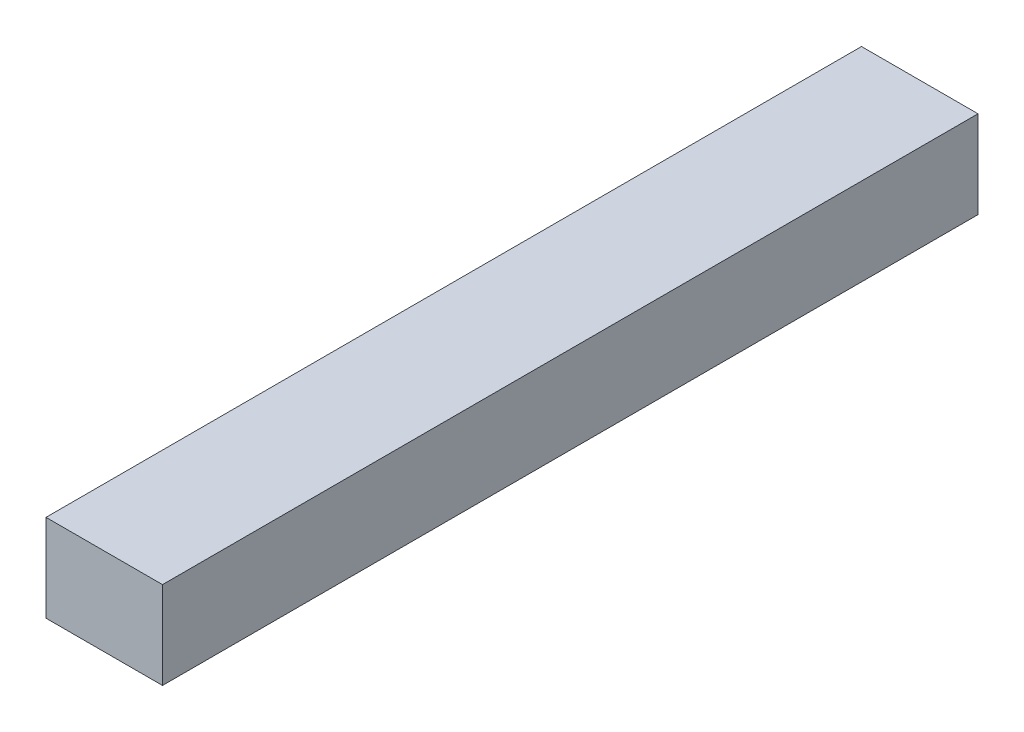
ISO-10303-21;
HEADER;
FILE_DESCRIPTION(('STEP AP214'),'2;1');
FILE_NAME('part.step','',(''),(''),'','','');
FILE_SCHEMA(('AUTOMOTIVE_DESIGN { 1 0 10303 214 1 1 1 1 }'));
ENDSEC;
DATA;
#1=APPLICATION_CONTEXT('core data for automotive mechanical design processes');
#2=APPLICATION_PROTOCOL_DEFINITION('international standard','automotive_design',2000,#1);
#3=PRODUCT_CONTEXT('',#1,'mechanical');
#4=PRODUCT('Part','Part','',(#3));
#5=PRODUCT_RELATED_PRODUCT_CATEGORY('part','',(#4));
#6=PRODUCT_DEFINITION_FORMATION('','',#4);
#7=PRODUCT_DEFINITION_CONTEXT('part definition',#1,'design');
#8=PRODUCT_DEFINITION('design','',#6,#7);
#9=PRODUCT_DEFINITION_SHAPE('','',#8);
#10=(LENGTH_UNIT() NAMED_UNIT(*) SI_UNIT(.MILLI.,.METRE.));
#11=(NAMED_UNIT(*) PLANE_ANGLE_UNIT() SI_UNIT($,.RADIAN.));
#12=(NAMED_UNIT(*) SI_UNIT($,.STERADIAN.) SOLID_ANGLE_UNIT());
#13=UNCERTAINTY_MEASURE_WITH_UNIT(LENGTH_MEASURE(1.E-05),#10,'distance_accuracy_value','');
#14=(GEOMETRIC_REPRESENTATION_CONTEXT(3) GLOBAL_UNCERTAINTY_ASSIGNED_CONTEXT((#13)) GLOBAL_UNIT_ASSIGNED_CONTEXT((#10,
#11,#12)) REPRESENTATION_CONTEXT('',''));
#15=CARTESIAN_POINT('',(0.,0.,0.));
#16=DIRECTION('',(0.,0.,1.));
#17=DIRECTION('',(1.,0.,0.));
#18=AXIS2_PLACEMENT_3D('',#15,#16,#17);
#19=CARTESIAN_POINT('',(25.4,0.,0.));
#20=DIRECTION('',(0.,0.,-1.));
#21=DIRECTION('',(-1.,0.,0.));
#22=AXIS2_PLACEMENT_3D('',#19,#20,#21);
#23=PLANE('',#22);
#24=DIRECTION('',(0.,-1.,0.));
#25=VECTOR('',#24,1.);
#26=CARTESIAN_POINT('',(0.,0.,0.));
#27=LINE('',#26,#25);
#28=CARTESIAN_POINT('',(0.,19.05,0.));
#29=VERTEX_POINT('',#28);
#30=CARTESIAN_POINT('',(0.,0.,0.));
#31=VERTEX_POINT('',#30);
#32=EDGE_CURVE('E96',#29,#31,#27,.T.);
#33=ORIENTED_EDGE('',*,*,#32,.T.);
#34=DIRECTION('',(-1.,0.,0.));
#35=VECTOR('',#34,1.);
#36=CARTESIAN_POINT('',(25.4,0.,0.));
#37=LINE('',#36,#35);
#38=CARTESIAN_POINT('',(25.4,0.,0.));
#39=VERTEX_POINT('',#38);
#40=EDGE_CURVE('E11',#39,#31,#37,.T.);
#41=ORIENTED_EDGE('',*,*,#40,.F.);
#42=DIRECTION('',(0.,-1.,0.));
#43=VECTOR('',#42,1.);
#44=CARTESIAN_POINT('',(25.4,0.,0.));
#45=LINE('',#44,#43);
#46=CARTESIAN_POINT('',(25.4,19.05,0.));
#47=VERTEX_POINT('',#46);
#48=EDGE_CURVE('E84',#47,#39,#45,.T.);
#49=ORIENTED_EDGE('',*,*,#48,.F.);
#50=DIRECTION('',(-1.,0.,0.));
#51=VECTOR('',#50,1.);
#52=CARTESIAN_POINT('',(25.4,19.05,0.));
#53=LINE('',#52,#51);
#54=EDGE_CURVE('E92',#47,#29,#53,.T.);
#55=ORIENTED_EDGE('',*,*,#54,.T.);
#56=EDGE_LOOP('',(#33,#41,#49,#55));
#57=FACE_BOUND('',#56,.T.);
#58=ADVANCED_FACE('F33',(#57),#23,.F.);
#59=CARTESIAN_POINT('',(25.4,0.,0.));
#60=DIRECTION('',(0.,1.,0.));
#61=DIRECTION('',(0.,0.,1.));
#62=AXIS2_PLACEMENT_3D('',#59,#60,#61);
#63=PLANE('',#62);
#64=DIRECTION('',(0.,0.,-1.));
#65=VECTOR('',#64,1.);
#66=CARTESIAN_POINT('',(0.,0.,0.));
#67=LINE('',#66,#65);
#68=CARTESIAN_POINT('',(0.,0.,-177.8));
#69=VERTEX_POINT('',#68);
#70=EDGE_CURVE('E88',#31,#69,#67,.T.);
#71=ORIENTED_EDGE('',*,*,#70,.T.);
#72=DIRECTION('',(-1.,0.,0.));
#73=VECTOR('',#72,1.);
#74=CARTESIAN_POINT('',(25.4,0.,-177.8));
#75=LINE('',#74,#73);
#76=CARTESIAN_POINT('',(25.4,0.,-177.8));
#77=VERTEX_POINT('',#76);
#78=EDGE_CURVE('E41',#77,#69,#75,.T.);
#79=ORIENTED_EDGE('',*,*,#78,.F.);
#80=DIRECTION('',(0.,0.,-1.));
#81=VECTOR('',#80,1.);
#82=CARTESIAN_POINT('',(25.4,0.,0.));
#83=LINE('',#82,#81);
#84=EDGE_CURVE('E79',#39,#77,#83,.T.);
#85=ORIENTED_EDGE('',*,*,#84,.F.);
#86=ORIENTED_EDGE('',*,*,#40,.T.);
#87=EDGE_LOOP('',(#71,#79,#85,#86));
#88=FACE_BOUND('',#87,.T.);
#89=ADVANCED_FACE('F87',(#88),#63,.F.);
#90=CARTESIAN_POINT('',(25.4,0.,-177.8));
#91=DIRECTION('',(0.,0.,1.));
#92=DIRECTION('',(1.,0.,0.));
#93=AXIS2_PLACEMENT_3D('',#90,#91,#92);
#94=PLANE('',#93);
#95=DIRECTION('',(0.,1.,0.));
#96=VECTOR('',#95,1.);
#97=CARTESIAN_POINT('',(0.,0.,-177.8));
#98=LINE('',#97,#96);
#99=CARTESIAN_POINT('',(0.,19.05,-177.8));
#100=VERTEX_POINT('',#99);
#101=EDGE_CURVE('E66',#69,#100,#98,.T.);
#102=ORIENTED_EDGE('',*,*,#101,.T.);
#103=DIRECTION('',(-1.,0.,0.));
#104=VECTOR('',#103,1.);
#105=CARTESIAN_POINT('',(25.4,19.05,-177.8));
#106=LINE('',#105,#104);
#107=CARTESIAN_POINT('',(25.4,19.05,-177.8));
#108=VERTEX_POINT('',#107);
#109=EDGE_CURVE('E89',#108,#100,#106,.T.);
#110=ORIENTED_EDGE('',*,*,#109,.F.);
#111=DIRECTION('',(0.,1.,0.));
#112=VECTOR('',#111,1.);
#113=CARTESIAN_POINT('',(25.4,0.,-177.8));
#114=LINE('',#113,#112);
#115=EDGE_CURVE('E82',#77,#108,#114,.T.);
#116=ORIENTED_EDGE('',*,*,#115,.F.);
#117=ORIENTED_EDGE('',*,*,#78,.T.);
#118=EDGE_LOOP('',(#102,#110,#116,#117));
#119=FACE_BOUND('',#118,.T.);
#120=ADVANCED_FACE('F90',(#119),#94,.F.);
#121=CARTESIAN_POINT('',(25.4,19.05,0.));
#122=DIRECTION('',(0.,-1.,0.));
#123=DIRECTION('',(0.,0.,-1.));
#124=AXIS2_PLACEMENT_3D('',#121,#122,#123);
#125=PLANE('',#124);
#126=DIRECTION('',(0.,0.,1.));
#127=VECTOR('',#126,1.);
#128=CARTESIAN_POINT('',(0.,19.05,0.));
#129=LINE('',#128,#127);
#130=EDGE_CURVE('E72',#100,#29,#129,.T.);
#131=ORIENTED_EDGE('',*,*,#130,.T.);
#132=ORIENTED_EDGE('',*,*,#54,.F.);
#133=DIRECTION('',(0.,0.,1.));
#134=VECTOR('',#133,1.);
#135=CARTESIAN_POINT('',(25.4,19.05,0.));
#136=LINE('',#135,#134);
#137=EDGE_CURVE('E49',#108,#47,#136,.T.);
#138=ORIENTED_EDGE('',*,*,#137,.F.);
#139=ORIENTED_EDGE('',*,*,#109,.T.);
#140=EDGE_LOOP('',(#131,#132,#138,#139));
#141=FACE_BOUND('',#140,.T.);
#142=ADVANCED_FACE('F103',(#141),#125,.F.);
#143=CARTESIAN_POINT('',(25.4,0.,0.));
#144=DIRECTION('',(-1.,0.,0.));
#145=DIRECTION('',(0.,0.,1.));
#146=AXIS2_PLACEMENT_3D('',#143,#144,#145);
#147=PLANE('',#146);
#148=ORIENTED_EDGE('',*,*,#48,.T.);
#149=ORIENTED_EDGE('',*,*,#84,.T.);
#150=ORIENTED_EDGE('',*,*,#115,.T.);
#151=ORIENTED_EDGE('',*,*,#137,.T.);
#152=EDGE_LOOP('',(#148,#149,#150,#151));
#153=FACE_BOUND('',#152,.T.);
#154=ADVANCED_FACE('F80',(#153),#147,.F.);
#155=CARTESIAN_POINT('',(0.,0.,0.));
#156=DIRECTION('',(-1.,0.,0.));
#157=DIRECTION('',(0.,0.,1.));
#158=AXIS2_PLACEMENT_3D('',#155,#156,#157);
#159=PLANE('',#158);
#160=ORIENTED_EDGE('',*,*,#32,.F.);
#161=ORIENTED_EDGE('',*,*,#130,.F.);
#162=ORIENTED_EDGE('',*,*,#101,.F.);
#163=ORIENTED_EDGE('',*,*,#70,.F.);
#164=EDGE_LOOP('',(#160,#161,#162,#163));
#165=FACE_BOUND('',#164,.T.);
#166=ADVANCED_FACE('F106',(#165),#159,.T.);
#167=CLOSED_SHELL('',(#58,#89,#120,#142,#154,#166));
#168=MANIFOLD_SOLID_BREP('B2',#167);
#169=ADVANCED_BREP_SHAPE_REPRESENTATION('',(#18,#168),#14);
#170=SHAPE_DEFINITION_REPRESENTATION(#9,#169);
ENDSEC;
END-ISO-10303-21;
